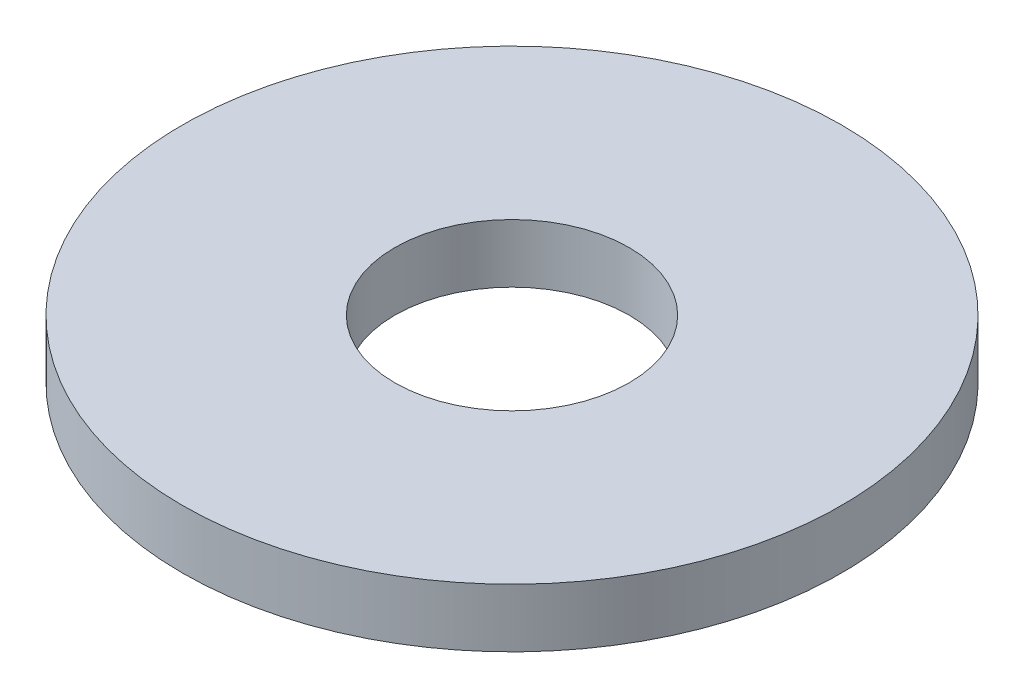
ISO-10303-21;
HEADER;
FILE_DESCRIPTION(('STEP AP214'),'2;1');
FILE_NAME('part.step','',(''),(''),'','','');
FILE_SCHEMA(('AUTOMOTIVE_DESIGN { 1 0 10303 214 1 1 1 1 }'));
ENDSEC;
DATA;
#1=APPLICATION_CONTEXT('core data for automotive mechanical design processes');
#2=APPLICATION_PROTOCOL_DEFINITION('international standard','automotive_design',2000,#1);
#3=PRODUCT_CONTEXT('',#1,'mechanical');
#4=PRODUCT('Part','Part','',(#3));
#5=PRODUCT_RELATED_PRODUCT_CATEGORY('part','',(#4));
#6=PRODUCT_DEFINITION_FORMATION('','',#4);
#7=PRODUCT_DEFINITION_CONTEXT('part definition',#1,'design');
#8=PRODUCT_DEFINITION('design','',#6,#7);
#9=PRODUCT_DEFINITION_SHAPE('','',#8);
#10=(LENGTH_UNIT() NAMED_UNIT(*) SI_UNIT(.MILLI.,.METRE.));
#11=(NAMED_UNIT(*) PLANE_ANGLE_UNIT() SI_UNIT($,.RADIAN.));
#12=(NAMED_UNIT(*) SI_UNIT($,.STERADIAN.) SOLID_ANGLE_UNIT());
#13=UNCERTAINTY_MEASURE_WITH_UNIT(LENGTH_MEASURE(1.E-05),#10,'distance_accuracy_value','');
#14=(GEOMETRIC_REPRESENTATION_CONTEXT(3) GLOBAL_UNCERTAINTY_ASSIGNED_CONTEXT((#13)) GLOBAL_UNIT_ASSIGNED_CONTEXT((#10,
#11,#12)) REPRESENTATION_CONTEXT('',''));
#15=CARTESIAN_POINT('',(0.,0.,0.));
#16=DIRECTION('',(0.,0.,1.));
#17=DIRECTION('',(1.,0.,0.));
#18=AXIS2_PLACEMENT_3D('',#15,#16,#17);
#19=CARTESIAN_POINT('',(0.,1.6,0.));
#20=DIRECTION('',(0.,1.,0.));
#21=DIRECTION('',(0.,0.,1.));
#22=AXIS2_PLACEMENT_3D('',#19,#20,#21);
#23=PLANE('',#22);
#24=CARTESIAN_POINT('',(0.,1.6,0.));
#25=DIRECTION('',(0.,1.,0.));
#26=DIRECTION('',(0.,0.,1.));
#27=AXIS2_PLACEMENT_3D('',#24,#25,#26);
#28=CIRCLE('',#27,9.);
#29=CARTESIAN_POINT('',(0.,1.6,9.));
#30=VERTEX_POINT('',#29);
#31=EDGE_CURVE('E10',#30,#30,#28,.T.);
#32=ORIENTED_EDGE('',*,*,#31,.T.);
#33=EDGE_LOOP('',(#32));
#34=FACE_BOUND('',#33,.T.);
#35=CARTESIAN_POINT('',(0.,1.6,0.));
#36=DIRECTION('',(0.,1.,0.));
#37=DIRECTION('',(0.,0.,1.));
#38=AXIS2_PLACEMENT_3D('',#35,#36,#37);
#39=CIRCLE('',#38,3.2);
#40=CARTESIAN_POINT('',(0.,1.6,3.2));
#41=VERTEX_POINT('',#40);
#42=EDGE_CURVE('E38',#41,#41,#39,.T.);
#43=ORIENTED_EDGE('',*,*,#42,.F.);
#44=EDGE_LOOP('',(#43));
#45=FACE_BOUND('',#44,.T.);
#46=ADVANCED_FACE('F27',(#34,#45),#23,.T.);
#47=CARTESIAN_POINT('',(0.,0.,0.));
#48=DIRECTION('',(0.,1.,0.));
#49=DIRECTION('',(0.,0.,1.));
#50=AXIS2_PLACEMENT_3D('',#47,#48,#49);
#51=PLANE('',#50);
#52=CARTESIAN_POINT('',(0.,0.,0.));
#53=DIRECTION('',(0.,1.,0.));
#54=DIRECTION('',(0.,0.,1.));
#55=AXIS2_PLACEMENT_3D('',#52,#53,#54);
#56=CIRCLE('',#55,9.);
#57=CARTESIAN_POINT('',(0.,0.,9.));
#58=VERTEX_POINT('',#57);
#59=EDGE_CURVE('E34',#58,#58,#56,.T.);
#60=ORIENTED_EDGE('',*,*,#59,.F.);
#61=EDGE_LOOP('',(#60));
#62=FACE_BOUND('',#61,.T.);
#63=CARTESIAN_POINT('',(0.,0.,0.));
#64=DIRECTION('',(0.,1.,0.));
#65=DIRECTION('',(0.,0.,1.));
#66=AXIS2_PLACEMENT_3D('',#63,#64,#65);
#67=CIRCLE('',#66,3.2);
#68=CARTESIAN_POINT('',(0.,0.,3.2));
#69=VERTEX_POINT('',#68);
#70=EDGE_CURVE('E42',#69,#69,#67,.T.);
#71=ORIENTED_EDGE('',*,*,#70,.T.);
#72=EDGE_LOOP('',(#71));
#73=FACE_BOUND('',#72,.T.);
#74=ADVANCED_FACE('F48',(#62,#73),#51,.F.);
#75=CARTESIAN_POINT('',(0.,1.6,0.));
#76=DIRECTION('',(0.,-1.,0.));
#77=DIRECTION('',(0.,0.,-1.));
#78=AXIS2_PLACEMENT_3D('',#75,#76,#77);
#79=CYLINDRICAL_SURFACE('',#78,9.);
#80=ORIENTED_EDGE('',*,*,#31,.F.);
#81=EDGE_LOOP('',(#80));
#82=FACE_BOUND('',#81,.T.);
#83=ORIENTED_EDGE('',*,*,#59,.T.);
#84=EDGE_LOOP('',(#83));
#85=FACE_BOUND('',#84,.T.);
#86=ADVANCED_FACE('F29',(#82,#85),#79,.T.);
#87=CARTESIAN_POINT('',(0.,1.6,0.));
#88=DIRECTION('',(0.,-1.,0.));
#89=DIRECTION('',(0.,0.,-1.));
#90=AXIS2_PLACEMENT_3D('',#87,#88,#89);
#91=CYLINDRICAL_SURFACE('',#90,3.2);
#92=ORIENTED_EDGE('',*,*,#42,.T.);
#93=EDGE_LOOP('',(#92));
#94=FACE_BOUND('',#93,.T.);
#95=ORIENTED_EDGE('',*,*,#70,.F.);
#96=EDGE_LOOP('',(#95));
#97=FACE_BOUND('',#96,.T.);
#98=ADVANCED_FACE('F50',(#94,#97),#91,.F.);
#99=CLOSED_SHELL('',(#46,#74,#86,#98));
#100=MANIFOLD_SOLID_BREP('B2',#99);
#101=ADVANCED_BREP_SHAPE_REPRESENTATION('',(#18,#100),#14);
#102=SHAPE_DEFINITION_REPRESENTATION(#9,#101);
ENDSEC;
END-ISO-10303-21;
